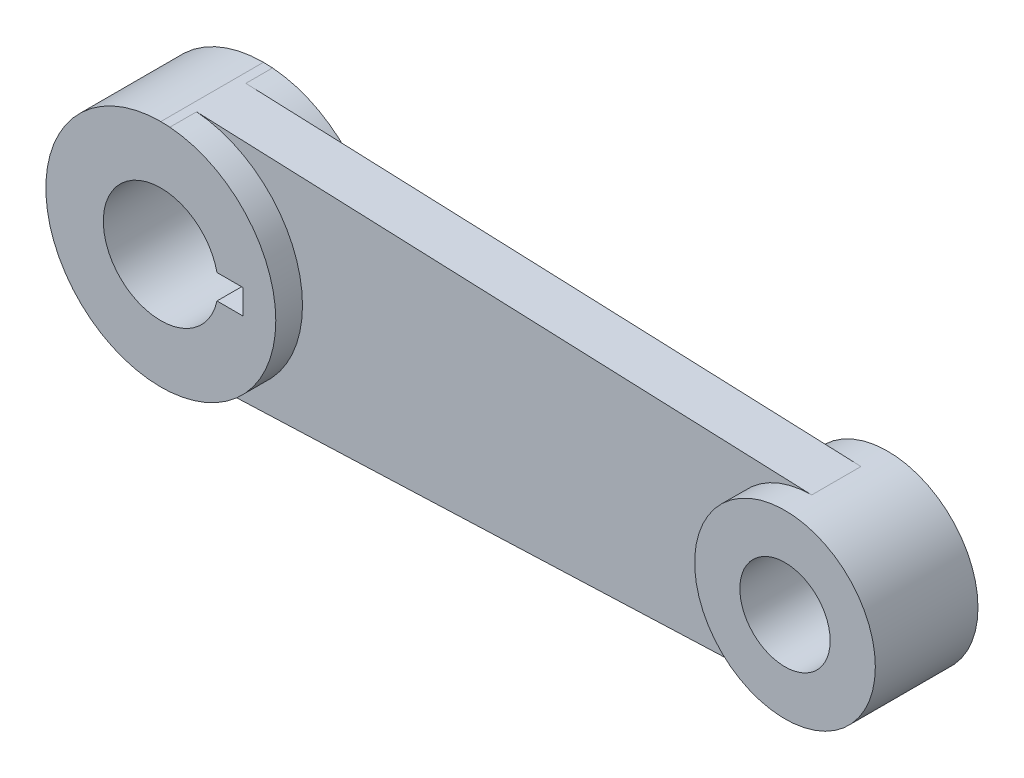
ISO-10303-21;
HEADER;
FILE_DESCRIPTION(('STEP AP214'),'2;1');
FILE_NAME('part.step','',(''),(''),'','','');
FILE_SCHEMA(('AUTOMOTIVE_DESIGN { 1 0 10303 214 1 1 1 1 }'));
ENDSEC;
DATA;
#1=APPLICATION_CONTEXT('core data for automotive mechanical design processes');
#2=APPLICATION_PROTOCOL_DEFINITION('international standard','automotive_design',2000,#1);
#3=PRODUCT_CONTEXT('',#1,'mechanical');
#4=PRODUCT('Part','Part','',(#3));
#5=PRODUCT_RELATED_PRODUCT_CATEGORY('part','',(#4));
#6=PRODUCT_DEFINITION_FORMATION('','',#4);
#7=PRODUCT_DEFINITION_CONTEXT('part definition',#1,'design');
#8=PRODUCT_DEFINITION('design','',#6,#7);
#9=PRODUCT_DEFINITION_SHAPE('','',#8);
#10=(LENGTH_UNIT() NAMED_UNIT(*) SI_UNIT(.MILLI.,.METRE.));
#11=(NAMED_UNIT(*) PLANE_ANGLE_UNIT() SI_UNIT($,.RADIAN.));
#12=(NAMED_UNIT(*) SI_UNIT($,.STERADIAN.) SOLID_ANGLE_UNIT());
#13=UNCERTAINTY_MEASURE_WITH_UNIT(LENGTH_MEASURE(1.E-05),#10,'distance_accuracy_value','');
#14=(GEOMETRIC_REPRESENTATION_CONTEXT(3) GLOBAL_UNCERTAINTY_ASSIGNED_CONTEXT((#13)) GLOBAL_UNIT_ASSIGNED_CONTEXT((#10,
#11,#12)) REPRESENTATION_CONTEXT('',''));
#15=CARTESIAN_POINT('',(0.,0.,0.));
#16=DIRECTION('',(0.,0.,1.));
#17=DIRECTION('',(1.,0.,0.));
#18=AXIS2_PLACEMENT_3D('',#15,#16,#17);
#19=CARTESIAN_POINT('',(0.,0.,-6.25000000000001));
#20=DIRECTION('',(0.,0.,1.));
#21=DIRECTION('',(1.,0.,0.));
#22=AXIS2_PLACEMENT_3D('',#19,#20,#21);
#23=PLANE('',#22);
#24=CARTESIAN_POINT('',(76.,0.,-6.25000000000001));
#25=DIRECTION('',(0.,0.,1.));
#26=DIRECTION('',(1.,0.,0.));
#27=AXIS2_PLACEMENT_3D('',#24,#25,#26);
#28=CIRCLE('',#27,5.50000000000002);
#29=CARTESIAN_POINT('',(81.5,0.,-6.25000000000001));
#30=VERTEX_POINT('',#29);
#31=EDGE_CURVE('E162',#30,#30,#28,.T.);
#32=ORIENTED_EDGE('',*,*,#31,.T.);
#33=EDGE_LOOP('',(#32));
#34=FACE_BOUND('',#33,.T.);
#35=CARTESIAN_POINT('',(76.,0.,-6.25000000000001));
#36=DIRECTION('',(0.,0.,1.));
#37=DIRECTION('',(1.,0.,0.));
#38=AXIS2_PLACEMENT_3D('',#35,#36,#37);
#39=CIRCLE('',#38,11.);
#40=CARTESIAN_POINT('',(87.,0.,-6.25000000000001));
#41=VERTEX_POINT('',#40);
#42=EDGE_CURVE('E183',#41,#41,#39,.T.);
#43=ORIENTED_EDGE('',*,*,#42,.F.);
#44=EDGE_LOOP('',(#43));
#45=FACE_BOUND('',#44,.T.);
#46=ADVANCED_FACE('F32',(#34,#45),#23,.F.);
#47=CARTESIAN_POINT('',(0.551771823681935,-13.9782195332757,6.25000000000001));
#48=DIRECTION('',(-0.0394429667135137,0.999221823409015,0.));
#49=DIRECTION('',(-0.999221823409015,-0.0394429667135137,0.));
#50=AXIS2_PLACEMENT_3D('',#47,#48,#49);
#51=PLANE('',#50);
#52=DIRECTION('',(0.999221823409015,0.0394429667135137,0.));
#53=VECTOR('',#52,1.);
#54=CARTESIAN_POINT('',(0.551771823681935,-13.9782195332757,-6.25000000000001));
#55=LINE('',#54,#53);
#56=CARTESIAN_POINT('',(0.,-14.,-6.25000000000001));
#57=VERTEX_POINT('',#56);
#58=CARTESIAN_POINT('',(1.10354364736374,-13.9564390665514,-6.25000000000001));
#59=VERTEX_POINT('',#58);
#60=EDGE_CURVE('E186',#57,#59,#55,.T.);
#61=ORIENTED_EDGE('',*,*,#60,.T.);
#62=DIRECTION('',(0.,0.,-1.));
#63=VECTOR('',#62,1.);
#64=CARTESIAN_POINT('',(1.10354364736374,-13.9564390665514,-3.));
#65=LINE('',#64,#63);
#66=CARTESIAN_POINT('',(1.10354364736374,-13.9564390665514,-3.));
#67=VERTEX_POINT('',#66);
#68=EDGE_CURVE('E49',#67,#59,#65,.T.);
#69=ORIENTED_EDGE('',*,*,#68,.F.);
#70=DIRECTION('',(0.999221823409015,0.0394429667135137,0.));
#71=VECTOR('',#70,1.);
#72=CARTESIAN_POINT('',(0.551771823681935,-13.9782195332757,-3.));
#73=LINE('',#72,#71);
#74=CARTESIAN_POINT('',(76.,-11.,-3.));
#75=VERTEX_POINT('',#74);
#76=EDGE_CURVE('E126',#67,#75,#73,.T.);
#77=ORIENTED_EDGE('',*,*,#76,.T.);
#78=DIRECTION('',(0.,0.,-1.));
#79=VECTOR('',#78,1.);
#80=CARTESIAN_POINT('',(76.,-11.,6.25000000000001));
#81=LINE('',#80,#79);
#82=CARTESIAN_POINT('',(76.,-11.,3.));
#83=VERTEX_POINT('',#82);
#84=EDGE_CURVE('E36',#83,#75,#81,.T.);
#85=ORIENTED_EDGE('',*,*,#84,.F.);
#86=DIRECTION('',(0.999221823409015,0.0394429667135137,0.));
#87=VECTOR('',#86,1.);
#88=CARTESIAN_POINT('',(0.551771823681935,-13.9782195332757,3.));
#89=LINE('',#88,#87);
#90=CARTESIAN_POINT('',(1.10354364736374,-13.9564390665514,3.));
#91=VERTEX_POINT('',#90);
#92=EDGE_CURVE('E213',#91,#83,#89,.T.);
#93=ORIENTED_EDGE('',*,*,#92,.F.);
#94=DIRECTION('',(0.,0.,1.));
#95=VECTOR('',#94,1.);
#96=CARTESIAN_POINT('',(1.10354364736374,-13.9564390665514,3.));
#97=LINE('',#96,#95);
#98=CARTESIAN_POINT('',(1.10354364736374,-13.9564390665514,6.25000000000001));
#99=VERTEX_POINT('',#98);
#100=EDGE_CURVE('E188',#91,#99,#97,.T.);
#101=ORIENTED_EDGE('',*,*,#100,.T.);
#102=DIRECTION('',(0.999221823409015,0.0394429667135137,0.));
#103=VECTOR('',#102,1.);
#104=CARTESIAN_POINT('',(0.551771823681935,-13.9782195332757,6.25000000000001));
#105=LINE('',#104,#103);
#106=CARTESIAN_POINT('',(0.,-14.,6.25000000000001));
#107=VERTEX_POINT('',#106);
#108=EDGE_CURVE('E165',#107,#99,#105,.T.);
#109=ORIENTED_EDGE('',*,*,#108,.F.);
#110=DIRECTION('',(0.,0.,-1.));
#111=VECTOR('',#110,1.);
#112=CARTESIAN_POINT('',(0.,-14.,6.25000000000001));
#113=LINE('',#112,#111);
#114=EDGE_CURVE('E152',#107,#57,#113,.T.);
#115=ORIENTED_EDGE('',*,*,#114,.T.);
#116=EDGE_LOOP('',(#61,#69,#77,#85,#93,#101,#109,#115));
#117=FACE_BOUND('',#116,.T.);
#118=ADVANCED_FACE('F34',(#117),#51,.F.);
#119=CARTESIAN_POINT('',(0.551771823681935,13.9782195332757,6.25000000000001));
#120=DIRECTION('',(0.0394429667135137,0.999221823409015,0.));
#121=DIRECTION('',(-0.999221823409015,0.0394429667135137,0.));
#122=AXIS2_PLACEMENT_3D('',#119,#120,#121);
#123=PLANE('',#122);
#124=DIRECTION('',(0.,0.,-1.));
#125=VECTOR('',#124,1.);
#126=CARTESIAN_POINT('',(1.10354364736374,13.9564390665514,-3.));
#127=LINE('',#126,#125);
#128=CARTESIAN_POINT('',(1.10354364736374,13.9564390665514,-3.));
#129=VERTEX_POINT('',#128);
#130=CARTESIAN_POINT('',(1.10354364736374,13.9564390665514,-6.25000000000001));
#131=VERTEX_POINT('',#130);
#132=EDGE_CURVE('E218',#129,#131,#127,.T.);
#133=ORIENTED_EDGE('',*,*,#132,.T.);
#134=DIRECTION('',(0.999221823409015,-0.0394429667135137,0.));
#135=VECTOR('',#134,1.);
#136=CARTESIAN_POINT('',(0.551771823681935,13.9782195332757,-6.25000000000001));
#137=LINE('',#136,#135);
#138=CARTESIAN_POINT('',(0.,14.,-6.25000000000001));
#139=VERTEX_POINT('',#138);
#140=EDGE_CURVE('E180',#139,#131,#137,.T.);
#141=ORIENTED_EDGE('',*,*,#140,.F.);
#142=DIRECTION('',(0.,0.,-1.));
#143=VECTOR('',#142,1.);
#144=CARTESIAN_POINT('',(0.,14.,6.25000000000001));
#145=LINE('',#144,#143);
#146=CARTESIAN_POINT('',(0.,14.,6.25000000000001));
#147=VERTEX_POINT('',#146);
#148=EDGE_CURVE('E149',#147,#139,#145,.T.);
#149=ORIENTED_EDGE('',*,*,#148,.F.);
#150=DIRECTION('',(0.999221823409015,-0.0394429667135137,0.));
#151=VECTOR('',#150,1.);
#152=CARTESIAN_POINT('',(0.551771823681935,13.9782195332757,6.25000000000001));
#153=LINE('',#152,#151);
#154=CARTESIAN_POINT('',(1.10354364736374,13.9564390665514,6.25000000000001));
#155=VERTEX_POINT('',#154);
#156=EDGE_CURVE('E204',#147,#155,#153,.T.);
#157=ORIENTED_EDGE('',*,*,#156,.T.);
#158=DIRECTION('',(0.,0.,1.));
#159=VECTOR('',#158,1.);
#160=CARTESIAN_POINT('',(1.10354364736374,13.9564390665514,3.));
#161=LINE('',#160,#159);
#162=CARTESIAN_POINT('',(1.10354364736374,13.9564390665514,3.));
#163=VERTEX_POINT('',#162);
#164=EDGE_CURVE('E57',#163,#155,#161,.T.);
#165=ORIENTED_EDGE('',*,*,#164,.F.);
#166=DIRECTION('',(-0.999221823409015,0.0394429667135137,0.));
#167=VECTOR('',#166,1.);
#168=CARTESIAN_POINT('',(0.551771823681935,13.9782195332757,3.));
#169=LINE('',#168,#167);
#170=CARTESIAN_POINT('',(76.,11.,3.));
#171=VERTEX_POINT('',#170);
#172=EDGE_CURVE('E222',#171,#163,#169,.T.);
#173=ORIENTED_EDGE('',*,*,#172,.F.);
#174=DIRECTION('',(0.,0.,-1.));
#175=VECTOR('',#174,1.);
#176=CARTESIAN_POINT('',(76.,11.,6.25000000000001));
#177=LINE('',#176,#175);
#178=CARTESIAN_POINT('',(76.,11.,-3.));
#179=VERTEX_POINT('',#178);
#180=EDGE_CURVE('E146',#171,#179,#177,.T.);
#181=ORIENTED_EDGE('',*,*,#180,.T.);
#182=DIRECTION('',(-0.999221823409015,0.0394429667135137,0.));
#183=VECTOR('',#182,1.);
#184=CARTESIAN_POINT('',(0.551771823681935,13.9782195332757,-3.));
#185=LINE('',#184,#183);
#186=EDGE_CURVE('E128',#179,#129,#185,.T.);
#187=ORIENTED_EDGE('',*,*,#186,.T.);
#188=EDGE_LOOP('',(#133,#141,#149,#157,#165,#173,#181,#187));
#189=FACE_BOUND('',#188,.T.);
#190=ADVANCED_FACE('F231',(#189),#123,.T.);
#191=CARTESIAN_POINT('',(0.,0.,6.25000000000001));
#192=DIRECTION('',(0.,0.,1.));
#193=DIRECTION('',(1.,0.,0.));
#194=AXIS2_PLACEMENT_3D('',#191,#192,#193);
#195=PLANE('',#194);
#196=CARTESIAN_POINT('',(76.,0.,6.25000000000001));
#197=DIRECTION('',(0.,0.,1.));
#198=DIRECTION('',(1.,0.,0.));
#199=AXIS2_PLACEMENT_3D('',#196,#197,#198);
#200=CIRCLE('',#199,5.50000000000002);
#201=CARTESIAN_POINT('',(81.5,0.,6.25000000000001));
#202=VERTEX_POINT('',#201);
#203=EDGE_CURVE('E156',#202,#202,#200,.T.);
#204=ORIENTED_EDGE('',*,*,#203,.F.);
#205=EDGE_LOOP('',(#204));
#206=FACE_BOUND('',#205,.T.);
#207=CARTESIAN_POINT('',(76.,0.,6.25000000000001));
#208=DIRECTION('',(0.,0.,1.));
#209=DIRECTION('',(1.,0.,0.));
#210=AXIS2_PLACEMENT_3D('',#207,#208,#209);
#211=CIRCLE('',#210,11.);
#212=CARTESIAN_POINT('',(87.,0.,6.25000000000001));
#213=VERTEX_POINT('',#212);
#214=EDGE_CURVE('E207',#213,#213,#211,.T.);
#215=ORIENTED_EDGE('',*,*,#214,.T.);
#216=EDGE_LOOP('',(#215));
#217=FACE_BOUND('',#216,.T.);
#218=ADVANCED_FACE('F268',(#206,#217),#195,.T.);
#219=CARTESIAN_POINT('',(0.,0.,6.25000000000001));
#220=DIRECTION('',(0.,0.,1.));
#221=DIRECTION('',(1.,0.,0.));
#222=AXIS2_PLACEMENT_3D('',#219,#220,#221);
#223=CIRCLE('',#222,7.);
#224=CARTESIAN_POINT('',(6.83739716558867,1.5,6.25000000000001));
#225=VERTEX_POINT('',#224);
#226=CARTESIAN_POINT('',(6.83739716558867,-1.5,6.25000000000001));
#227=VERTEX_POINT('',#226);
#228=EDGE_CURVE('E199',#225,#227,#223,.T.);
#229=ORIENTED_EDGE('',*,*,#228,.F.);
#230=DIRECTION('',(1.,0.,0.));
#231=VECTOR('',#230,1.);
#232=CARTESIAN_POINT('',(0.,1.5,6.25000000000001));
#233=LINE('',#232,#231);
#234=CARTESIAN_POINT('',(10.,1.5,6.25000000000001));
#235=VERTEX_POINT('',#234);
#236=EDGE_CURVE('E196',#225,#235,#233,.T.);
#237=ORIENTED_EDGE('',*,*,#236,.T.);
#238=DIRECTION('',(0.,-1.,0.));
#239=VECTOR('',#238,1.);
#240=CARTESIAN_POINT('',(10.,0.,6.25000000000001));
#241=LINE('',#240,#239);
#242=CARTESIAN_POINT('',(10.,-1.5,6.25000000000001));
#243=VERTEX_POINT('',#242);
#244=EDGE_CURVE('E193',#235,#243,#241,.T.);
#245=ORIENTED_EDGE('',*,*,#244,.T.);
#246=DIRECTION('',(-1.,0.,0.));
#247=VECTOR('',#246,1.);
#248=CARTESIAN_POINT('',(0.,-1.5,6.25000000000001));
#249=LINE('',#248,#247);
#250=EDGE_CURVE('E191',#243,#227,#249,.T.);
#251=ORIENTED_EDGE('',*,*,#250,.T.);
#252=EDGE_LOOP('',(#229,#237,#245,#251));
#253=FACE_BOUND('',#252,.T.);
#254=ORIENTED_EDGE('',*,*,#108,.T.);
#255=CARTESIAN_POINT('',(0.,0.,6.25000000000001));
#256=DIRECTION('',(0.,0.,1.));
#257=DIRECTION('',(1.,0.,0.));
#258=AXIS2_PLACEMENT_3D('',#255,#256,#257);
#259=CIRCLE('',#258,14.);
#260=EDGE_CURVE('E216',#99,#155,#259,.T.);
#261=ORIENTED_EDGE('',*,*,#260,.T.);
#262=ORIENTED_EDGE('',*,*,#156,.F.);
#263=CARTESIAN_POINT('',(0.,0.,6.25000000000001));
#264=DIRECTION('',(0.,0.,1.));
#265=DIRECTION('',(1.,0.,0.));
#266=AXIS2_PLACEMENT_3D('',#263,#264,#265);
#267=CIRCLE('',#266,14.);
#268=EDGE_CURVE('E202',#147,#107,#267,.T.);
#269=ORIENTED_EDGE('',*,*,#268,.T.);
#270=EDGE_LOOP('',(#254,#261,#262,#269));
#271=FACE_BOUND('',#270,.T.);
#272=ADVANCED_FACE('F244',(#253,#271),#195,.T.);
#273=CARTESIAN_POINT('',(0.,0.,6.25000000000001));
#274=DIRECTION('',(0.,0.,-1.));
#275=DIRECTION('',(-1.,0.,0.));
#276=AXIS2_PLACEMENT_3D('',#273,#274,#275);
#277=CYLINDRICAL_SURFACE('',#276,7.);
#278=CARTESIAN_POINT('',(0.,0.,-6.25000000000001));
#279=DIRECTION('',(0.,0.,1.));
#280=DIRECTION('',(1.,0.,0.));
#281=AXIS2_PLACEMENT_3D('',#278,#279,#280);
#282=CIRCLE('',#281,7.);
#283=CARTESIAN_POINT('',(6.83739716558867,1.5,-6.25000000000001));
#284=VERTEX_POINT('',#283);
#285=CARTESIAN_POINT('',(6.83739716558867,-1.5,-6.25000000000001));
#286=VERTEX_POINT('',#285);
#287=EDGE_CURVE('E175',#284,#286,#282,.T.);
#288=ORIENTED_EDGE('',*,*,#287,.F.);
#289=DIRECTION('',(0.,0.,-1.));
#290=VECTOR('',#289,1.);
#291=CARTESIAN_POINT('',(6.83739716558867,1.5,6.25000000000001));
#292=LINE('',#291,#290);
#293=EDGE_CURVE('E11',#225,#284,#292,.T.);
#294=ORIENTED_EDGE('',*,*,#293,.F.);
#295=ORIENTED_EDGE('',*,*,#228,.T.);
#296=DIRECTION('',(0.,0.,-1.));
#297=VECTOR('',#296,1.);
#298=CARTESIAN_POINT('',(6.83739716558867,-1.5,6.25000000000001));
#299=LINE('',#298,#297);
#300=EDGE_CURVE('E145',#227,#286,#299,.T.);
#301=ORIENTED_EDGE('',*,*,#300,.T.);
#302=EDGE_LOOP('',(#288,#294,#295,#301));
#303=FACE_BOUND('',#302,.T.);
#304=ADVANCED_FACE('F283',(#303),#277,.F.);
#305=CARTESIAN_POINT('',(0.,1.5,6.25000000000001));
#306=DIRECTION('',(0.,1.,0.));
#307=DIRECTION('',(-1.,0.,0.));
#308=AXIS2_PLACEMENT_3D('',#305,#306,#307);
#309=PLANE('',#308);
#310=DIRECTION('',(1.,0.,0.));
#311=VECTOR('',#310,1.);
#312=CARTESIAN_POINT('',(0.,1.5,-6.25000000000001));
#313=LINE('',#312,#311);
#314=CARTESIAN_POINT('',(10.,1.5,-6.25000000000001));
#315=VERTEX_POINT('',#314);
#316=EDGE_CURVE('E172',#284,#315,#313,.T.);
#317=ORIENTED_EDGE('',*,*,#316,.T.);
#318=DIRECTION('',(0.,0.,-1.));
#319=VECTOR('',#318,1.);
#320=CARTESIAN_POINT('',(10.,1.5,6.25000000000001));
#321=LINE('',#320,#319);
#322=EDGE_CURVE('E41',#235,#315,#321,.T.);
#323=ORIENTED_EDGE('',*,*,#322,.F.);
#324=ORIENTED_EDGE('',*,*,#236,.F.);
#325=ORIENTED_EDGE('',*,*,#293,.T.);
#326=EDGE_LOOP('',(#317,#323,#324,#325));
#327=FACE_BOUND('',#326,.T.);
#328=ADVANCED_FACE('F279',(#327),#309,.F.);
#329=CARTESIAN_POINT('',(10.,0.,6.25000000000001));
#330=DIRECTION('',(1.,0.,0.));
#331=DIRECTION('',(0.,0.,-1.));
#332=AXIS2_PLACEMENT_3D('',#329,#330,#331);
#333=PLANE('',#332);
#334=DIRECTION('',(0.,-1.,0.));
#335=VECTOR('',#334,1.);
#336=CARTESIAN_POINT('',(10.,0.,-6.25000000000001));
#337=LINE('',#336,#335);
#338=CARTESIAN_POINT('',(10.,-1.5,-6.25000000000001));
#339=VERTEX_POINT('',#338);
#340=EDGE_CURVE('E169',#315,#339,#337,.T.);
#341=ORIENTED_EDGE('',*,*,#340,.T.);
#342=DIRECTION('',(0.,0.,-1.));
#343=VECTOR('',#342,1.);
#344=CARTESIAN_POINT('',(10.,-1.5,6.25000000000001));
#345=LINE('',#344,#343);
#346=EDGE_CURVE('E147',#243,#339,#345,.T.);
#347=ORIENTED_EDGE('',*,*,#346,.F.);
#348=ORIENTED_EDGE('',*,*,#244,.F.);
#349=ORIENTED_EDGE('',*,*,#322,.T.);
#350=EDGE_LOOP('',(#341,#347,#348,#349));
#351=FACE_BOUND('',#350,.T.);
#352=ADVANCED_FACE('F276',(#351),#333,.F.);
#353=CARTESIAN_POINT('',(76.,0.,6.25000000000001));
#354=DIRECTION('',(0.,0.,-1.));
#355=DIRECTION('',(-1.,0.,0.));
#356=AXIS2_PLACEMENT_3D('',#353,#354,#355);
#357=CYLINDRICAL_SURFACE('',#356,11.);
#358=ORIENTED_EDGE('',*,*,#42,.T.);
#359=EDGE_LOOP('',(#358));
#360=FACE_BOUND('',#359,.T.);
#361=CARTESIAN_POINT('',(76.,0.,3.));
#362=DIRECTION('',(0.,0.,1.));
#363=DIRECTION('',(1.,0.,0.));
#364=AXIS2_PLACEMENT_3D('',#361,#362,#363);
#365=CIRCLE('',#364,11.);
#366=EDGE_CURVE('E143',#171,#83,#365,.T.);
#367=ORIENTED_EDGE('',*,*,#366,.T.);
#368=ORIENTED_EDGE('',*,*,#84,.T.);
#369=CARTESIAN_POINT('',(76.,0.,-3.));
#370=DIRECTION('',(0.,0.,1.));
#371=DIRECTION('',(1.,0.,0.));
#372=AXIS2_PLACEMENT_3D('',#369,#370,#371);
#373=CIRCLE('',#372,11.);
#374=EDGE_CURVE('E122',#179,#75,#373,.T.);
#375=ORIENTED_EDGE('',*,*,#374,.F.);
#376=ORIENTED_EDGE('',*,*,#180,.F.);
#377=EDGE_LOOP('',(#367,#368,#375,#376));
#378=FACE_BOUND('',#377,.T.);
#379=ORIENTED_EDGE('',*,*,#214,.F.);
#380=EDGE_LOOP('',(#379));
#381=FACE_BOUND('',#380,.T.);
#382=ADVANCED_FACE('F141',(#360,#378,#381),#357,.T.);
#383=CARTESIAN_POINT('',(0.,-1.5,6.25000000000001));
#384=DIRECTION('',(0.,-1.,0.));
#385=DIRECTION('',(1.,0.,0.));
#386=AXIS2_PLACEMENT_3D('',#383,#384,#385);
#387=PLANE('',#386);
#388=DIRECTION('',(-1.,0.,0.));
#389=VECTOR('',#388,1.);
#390=CARTESIAN_POINT('',(0.,-1.5,-6.25000000000001));
#391=LINE('',#390,#389);
#392=EDGE_CURVE('E166',#339,#286,#391,.T.);
#393=ORIENTED_EDGE('',*,*,#392,.T.);
#394=ORIENTED_EDGE('',*,*,#300,.F.);
#395=ORIENTED_EDGE('',*,*,#250,.F.);
#396=ORIENTED_EDGE('',*,*,#346,.T.);
#397=EDGE_LOOP('',(#393,#394,#395,#396));
#398=FACE_BOUND('',#397,.T.);
#399=ADVANCED_FACE('F272',(#398),#387,.F.);
#400=CARTESIAN_POINT('',(0.,0.,6.25000000000001));
#401=DIRECTION('',(0.,0.,-1.));
#402=DIRECTION('',(-1.,0.,0.));
#403=AXIS2_PLACEMENT_3D('',#400,#401,#402);
#404=CYLINDRICAL_SURFACE('',#403,14.);
#405=CARTESIAN_POINT('',(0.,0.,-6.25000000000001));
#406=DIRECTION('',(0.,0.,1.));
#407=DIRECTION('',(1.,0.,0.));
#408=AXIS2_PLACEMENT_3D('',#405,#406,#407);
#409=CIRCLE('',#408,14.);
#410=EDGE_CURVE('E178',#139,#57,#409,.T.);
#411=ORIENTED_EDGE('',*,*,#410,.T.);
#412=ORIENTED_EDGE('',*,*,#114,.F.);
#413=ORIENTED_EDGE('',*,*,#268,.F.);
#414=ORIENTED_EDGE('',*,*,#148,.T.);
#415=EDGE_LOOP('',(#411,#412,#413,#414));
#416=FACE_BOUND('',#415,.T.);
#417=ADVANCED_FACE('F240',(#416),#404,.T.);
#418=CARTESIAN_POINT('',(76.,0.,6.25000000000001));
#419=DIRECTION('',(0.,0.,-1.));
#420=DIRECTION('',(-1.,0.,0.));
#421=AXIS2_PLACEMENT_3D('',#418,#419,#420);
#422=CYLINDRICAL_SURFACE('',#421,5.50000000000002);
#423=ORIENTED_EDGE('',*,*,#203,.T.);
#424=EDGE_LOOP('',(#423));
#425=FACE_BOUND('',#424,.T.);
#426=ORIENTED_EDGE('',*,*,#31,.F.);
#427=EDGE_LOOP('',(#426));
#428=FACE_BOUND('',#427,.T.);
#429=ADVANCED_FACE('F258',(#425,#428),#422,.F.);
#430=ORIENTED_EDGE('',*,*,#140,.T.);
#431=CARTESIAN_POINT('',(0.,0.,-6.25000000000001));
#432=DIRECTION('',(0.,0.,1.));
#433=DIRECTION('',(1.,0.,0.));
#434=AXIS2_PLACEMENT_3D('',#431,#432,#433);
#435=CIRCLE('',#434,14.);
#436=EDGE_CURVE('E133',#59,#131,#435,.T.);
#437=ORIENTED_EDGE('',*,*,#436,.F.);
#438=ORIENTED_EDGE('',*,*,#60,.F.);
#439=ORIENTED_EDGE('',*,*,#410,.F.);
#440=EDGE_LOOP('',(#430,#437,#438,#439));
#441=FACE_BOUND('',#440,.T.);
#442=ORIENTED_EDGE('',*,*,#287,.T.);
#443=ORIENTED_EDGE('',*,*,#392,.F.);
#444=ORIENTED_EDGE('',*,*,#340,.F.);
#445=ORIENTED_EDGE('',*,*,#316,.F.);
#446=EDGE_LOOP('',(#442,#443,#444,#445));
#447=FACE_BOUND('',#446,.T.);
#448=ADVANCED_FACE('F235',(#441,#447),#23,.F.);
#449=CARTESIAN_POINT('',(0.,0.,3.));
#450=DIRECTION('',(0.,0.,1.));
#451=DIRECTION('',(1.,0.,0.));
#452=AXIS2_PLACEMENT_3D('',#449,#450,#451);
#453=CYLINDRICAL_SURFACE('',#452,14.);
#454=ORIENTED_EDGE('',*,*,#260,.F.);
#455=ORIENTED_EDGE('',*,*,#100,.F.);
#456=CARTESIAN_POINT('',(0.,0.,3.));
#457=DIRECTION('',(0.,0.,1.));
#458=DIRECTION('',(1.,0.,0.));
#459=AXIS2_PLACEMENT_3D('',#456,#457,#458);
#460=CIRCLE('',#459,14.);
#461=EDGE_CURVE('E220',#91,#163,#460,.T.);
#462=ORIENTED_EDGE('',*,*,#461,.T.);
#463=ORIENTED_EDGE('',*,*,#164,.T.);
#464=EDGE_LOOP('',(#454,#455,#462,#463));
#465=FACE_BOUND('',#464,.T.);
#466=ADVANCED_FACE('F249',(#465),#453,.T.);
#467=CARTESIAN_POINT('',(0.,0.,3.));
#468=DIRECTION('',(0.,0.,1.));
#469=DIRECTION('',(1.,0.,0.));
#470=AXIS2_PLACEMENT_3D('',#467,#468,#469);
#471=PLANE('',#470);
#472=ORIENTED_EDGE('',*,*,#366,.F.);
#473=ORIENTED_EDGE('',*,*,#172,.T.);
#474=ORIENTED_EDGE('',*,*,#461,.F.);
#475=ORIENTED_EDGE('',*,*,#92,.T.);
#476=EDGE_LOOP('',(#472,#473,#474,#475));
#477=FACE_BOUND('',#476,.T.);
#478=ADVANCED_FACE('F248',(#477),#471,.T.);
#479=CARTESIAN_POINT('',(0.,0.,-3.));
#480=DIRECTION('',(0.,0.,-1.));
#481=DIRECTION('',(-1.,0.,0.));
#482=AXIS2_PLACEMENT_3D('',#479,#480,#481);
#483=CYLINDRICAL_SURFACE('',#482,14.);
#484=ORIENTED_EDGE('',*,*,#436,.T.);
#485=ORIENTED_EDGE('',*,*,#132,.F.);
#486=CARTESIAN_POINT('',(0.,0.,-3.));
#487=DIRECTION('',(0.,0.,1.));
#488=DIRECTION('',(1.,0.,0.));
#489=AXIS2_PLACEMENT_3D('',#486,#487,#488);
#490=CIRCLE('',#489,14.);
#491=EDGE_CURVE('E139',#67,#129,#490,.T.);
#492=ORIENTED_EDGE('',*,*,#491,.F.);
#493=ORIENTED_EDGE('',*,*,#68,.T.);
#494=EDGE_LOOP('',(#484,#485,#492,#493));
#495=FACE_BOUND('',#494,.T.);
#496=ADVANCED_FACE('F256',(#495),#483,.T.);
#497=CARTESIAN_POINT('',(0.,0.,-3.));
#498=DIRECTION('',(0.,0.,-1.));
#499=DIRECTION('',(1.,0.,0.));
#500=AXIS2_PLACEMENT_3D('',#497,#498,#499);
#501=PLANE('',#500);
#502=ORIENTED_EDGE('',*,*,#374,.T.);
#503=ORIENTED_EDGE('',*,*,#76,.F.);
#504=ORIENTED_EDGE('',*,*,#491,.T.);
#505=ORIENTED_EDGE('',*,*,#186,.F.);
#506=EDGE_LOOP('',(#502,#503,#504,#505));
#507=FACE_BOUND('',#506,.T.);
#508=ADVANCED_FACE('F124',(#507),#501,.T.);
#509=CLOSED_SHELL('',(#46,#118,#190,#218,#272,#304,#328,#352,#382,#399,#417,#429,#448,#466,#478,
#496,#508));
#510=MANIFOLD_SOLID_BREP('B2',#509);
#511=ADVANCED_BREP_SHAPE_REPRESENTATION('',(#18,#510),#14);
#512=SHAPE_DEFINITION_REPRESENTATION(#9,#511);
ENDSEC;
END-ISO-10303-21;
